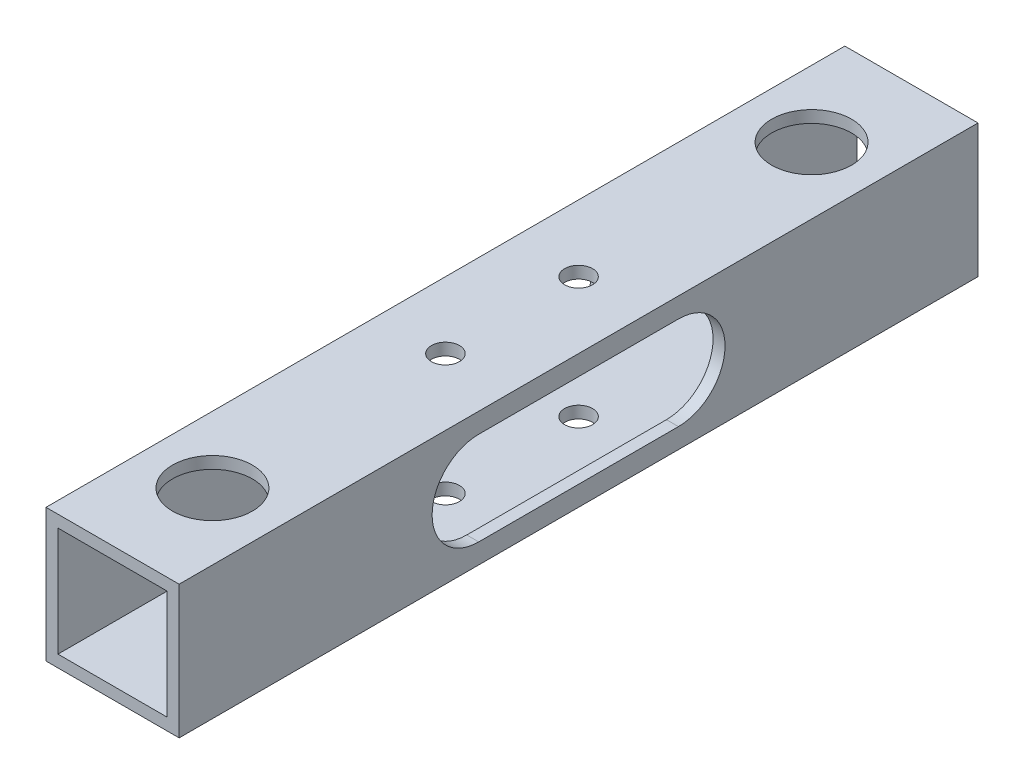
ISO-10303-21;
HEADER;
FILE_DESCRIPTION(('STEP AP214'),'2;1');
FILE_NAME('part.step','',(''),(''),'','','');
FILE_SCHEMA(('AUTOMOTIVE_DESIGN { 1 0 10303 214 1 1 1 1 }'));
ENDSEC;
DATA;
#1=APPLICATION_CONTEXT('core data for automotive mechanical design processes');
#2=APPLICATION_PROTOCOL_DEFINITION('international standard','automotive_design',2000,#1);
#3=PRODUCT_CONTEXT('',#1,'mechanical');
#4=PRODUCT('Part','Part','',(#3));
#5=PRODUCT_RELATED_PRODUCT_CATEGORY('part','',(#4));
#6=PRODUCT_DEFINITION_FORMATION('','',#4);
#7=PRODUCT_DEFINITION_CONTEXT('part definition',#1,'design');
#8=PRODUCT_DEFINITION('design','',#6,#7);
#9=PRODUCT_DEFINITION_SHAPE('','',#8);
#10=(LENGTH_UNIT() NAMED_UNIT(*) SI_UNIT(.MILLI.,.METRE.));
#11=(NAMED_UNIT(*) PLANE_ANGLE_UNIT() SI_UNIT($,.RADIAN.));
#12=(NAMED_UNIT(*) SI_UNIT($,.STERADIAN.) SOLID_ANGLE_UNIT());
#13=UNCERTAINTY_MEASURE_WITH_UNIT(LENGTH_MEASURE(1.E-05),#10,'distance_accuracy_value','');
#14=(GEOMETRIC_REPRESENTATION_CONTEXT(3) GLOBAL_UNCERTAINTY_ASSIGNED_CONTEXT((#13)) GLOBAL_UNIT_ASSIGNED_CONTEXT((#10,
#11,#12)) REPRESENTATION_CONTEXT('',''));
#15=CARTESIAN_POINT('',(0.,0.,0.));
#16=DIRECTION('',(0.,0.,1.));
#17=DIRECTION('',(1.,0.,0.));
#18=AXIS2_PLACEMENT_3D('',#15,#16,#17);
#19=CARTESIAN_POINT('',(0.,20.,-120.));
#20=DIRECTION('',(0.,1.,0.));
#21=DIRECTION('',(0.,0.,1.));
#22=AXIS2_PLACEMENT_3D('',#19,#20,#21);
#23=PLANE('',#22);
#24=CARTESIAN_POINT('',(10.,20.,-15.));
#25=DIRECTION('',(0.,-1.,0.));
#26=DIRECTION('',(0.,0.,-1.));
#27=AXIS2_PLACEMENT_3D('',#24,#25,#26);
#28=CIRCLE('',#27,6.);
#29=CARTESIAN_POINT('',(10.,20.,-21.));
#30=VERTEX_POINT('',#29);
#31=EDGE_CURVE('E395',#30,#30,#28,.T.);
#32=ORIENTED_EDGE('',*,*,#31,.T.);
#33=EDGE_LOOP('',(#32));
#34=FACE_BOUND('',#33,.T.);
#35=CARTESIAN_POINT('',(10.,20.,-70.));
#36=DIRECTION('',(0.,-1.,0.));
#37=DIRECTION('',(0.,0.,-1.));
#38=AXIS2_PLACEMENT_3D('',#35,#36,#37);
#39=CIRCLE('',#38,2.1);
#40=CARTESIAN_POINT('',(10.,20.,-72.1));
#41=VERTEX_POINT('',#40);
#42=EDGE_CURVE('E219',#41,#41,#39,.T.);
#43=ORIENTED_EDGE('',*,*,#42,.T.);
#44=EDGE_LOOP('',(#43));
#45=FACE_BOUND('',#44,.T.);
#46=CARTESIAN_POINT('',(10.,20.,-50.));
#47=DIRECTION('',(0.,-1.,0.));
#48=DIRECTION('',(0.,0.,-1.));
#49=AXIS2_PLACEMENT_3D('',#46,#47,#48);
#50=CIRCLE('',#49,2.1);
#51=CARTESIAN_POINT('',(10.,20.,-52.1));
#52=VERTEX_POINT('',#51);
#53=EDGE_CURVE('E229',#52,#52,#50,.T.);
#54=ORIENTED_EDGE('',*,*,#53,.T.);
#55=EDGE_LOOP('',(#54));
#56=FACE_BOUND('',#55,.T.);
#57=DIRECTION('',(-1.,0.,0.));
#58=VECTOR('',#57,1.);
#59=CARTESIAN_POINT('',(0.,20.,0.));
#60=LINE('',#59,#58);
#61=CARTESIAN_POINT('',(20.,20.,0.));
#62=VERTEX_POINT('',#61);
#63=CARTESIAN_POINT('',(0.,20.,0.));
#64=VERTEX_POINT('',#63);
#65=EDGE_CURVE('E279',#62,#64,#60,.T.);
#66=ORIENTED_EDGE('',*,*,#65,.F.);
#67=DIRECTION('',(0.,0.,1.));
#68=VECTOR('',#67,1.);
#69=CARTESIAN_POINT('',(20.,20.,-120.));
#70=LINE('',#69,#68);
#71=CARTESIAN_POINT('',(20.,20.,-120.));
#72=VERTEX_POINT('',#71);
#73=EDGE_CURVE('E302',#72,#62,#70,.T.);
#74=ORIENTED_EDGE('',*,*,#73,.F.);
#75=DIRECTION('',(-1.,0.,0.));
#76=VECTOR('',#75,1.);
#77=CARTESIAN_POINT('',(0.,20.,-120.));
#78=LINE('',#77,#76);
#79=CARTESIAN_POINT('',(0.,20.,-120.));
#80=VERTEX_POINT('',#79);
#81=EDGE_CURVE('E285',#72,#80,#78,.T.);
#82=ORIENTED_EDGE('',*,*,#81,.T.);
#83=DIRECTION('',(0.,0.,1.));
#84=VECTOR('',#83,1.);
#85=CARTESIAN_POINT('',(0.,20.,-120.));
#86=LINE('',#85,#84);
#87=EDGE_CURVE('E299',#80,#64,#86,.T.);
#88=ORIENTED_EDGE('',*,*,#87,.T.);
#89=EDGE_LOOP('',(#66,#74,#82,#88));
#90=FACE_BOUND('',#89,.T.);
#91=CARTESIAN_POINT('',(10.,20.,-105.));
#92=DIRECTION('',(0.,-1.,0.));
#93=DIRECTION('',(0.,0.,-1.));
#94=AXIS2_PLACEMENT_3D('',#91,#92,#93);
#95=CIRCLE('',#94,6.);
#96=CARTESIAN_POINT('',(10.,20.,-111.));
#97=VERTEX_POINT('',#96);
#98=EDGE_CURVE('E188',#97,#97,#95,.T.);
#99=ORIENTED_EDGE('',*,*,#98,.T.);
#100=EDGE_LOOP('',(#99));
#101=FACE_BOUND('',#100,.T.);
#102=ADVANCED_FACE('F37',(#34,#45,#56,#90,#101),#23,.T.);
#103=CARTESIAN_POINT('',(1.8,18.2,-120.));
#104=DIRECTION('',(0.,1.,0.));
#105=DIRECTION('',(0.,0.,1.));
#106=AXIS2_PLACEMENT_3D('',#103,#104,#105);
#107=PLANE('',#106);
#108=CARTESIAN_POINT('',(10.,18.2,-15.));
#109=DIRECTION('',(0.,1.,0.));
#110=DIRECTION('',(0.,0.,1.));
#111=AXIS2_PLACEMENT_3D('',#108,#109,#110);
#112=CIRCLE('',#111,6.);
#113=CARTESIAN_POINT('',(10.,18.2,-9.));
#114=VERTEX_POINT('',#113);
#115=EDGE_CURVE('E181',#114,#114,#112,.T.);
#116=ORIENTED_EDGE('',*,*,#115,.T.);
#117=EDGE_LOOP('',(#116));
#118=FACE_BOUND('',#117,.T.);
#119=CARTESIAN_POINT('',(10.,18.2,-70.));
#120=DIRECTION('',(0.,1.,0.));
#121=DIRECTION('',(0.,0.,1.));
#122=AXIS2_PLACEMENT_3D('',#119,#120,#121);
#123=CIRCLE('',#122,2.1);
#124=CARTESIAN_POINT('',(10.,18.2,-67.9));
#125=VERTEX_POINT('',#124);
#126=EDGE_CURVE('E223',#125,#125,#123,.T.);
#127=ORIENTED_EDGE('',*,*,#126,.T.);
#128=EDGE_LOOP('',(#127));
#129=FACE_BOUND('',#128,.T.);
#130=CARTESIAN_POINT('',(10.,18.2,-50.));
#131=DIRECTION('',(0.,1.,0.));
#132=DIRECTION('',(0.,0.,1.));
#133=AXIS2_PLACEMENT_3D('',#130,#131,#132);
#134=CIRCLE('',#133,2.1);
#135=CARTESIAN_POINT('',(10.,18.2,-47.9));
#136=VERTEX_POINT('',#135);
#137=EDGE_CURVE('E235',#136,#136,#134,.T.);
#138=ORIENTED_EDGE('',*,*,#137,.T.);
#139=EDGE_LOOP('',(#138));
#140=FACE_BOUND('',#139,.T.);
#141=DIRECTION('',(-1.,0.,0.));
#142=VECTOR('',#141,1.);
#143=CARTESIAN_POINT('',(1.8,18.2,0.));
#144=LINE('',#143,#142);
#145=CARTESIAN_POINT('',(18.2,18.2,0.));
#146=VERTEX_POINT('',#145);
#147=CARTESIAN_POINT('',(1.8,18.2,0.));
#148=VERTEX_POINT('',#147);
#149=EDGE_CURVE('E246',#146,#148,#144,.T.);
#150=ORIENTED_EDGE('',*,*,#149,.T.);
#151=DIRECTION('',(0.,0.,1.));
#152=VECTOR('',#151,1.);
#153=CARTESIAN_POINT('',(1.8,18.2,-120.));
#154=LINE('',#153,#152);
#155=CARTESIAN_POINT('',(1.8,18.2,-120.));
#156=VERTEX_POINT('',#155);
#157=EDGE_CURVE('E266',#156,#148,#154,.T.);
#158=ORIENTED_EDGE('',*,*,#157,.F.);
#159=DIRECTION('',(-1.,0.,0.));
#160=VECTOR('',#159,1.);
#161=CARTESIAN_POINT('',(1.8,18.2,-120.));
#162=LINE('',#161,#160);
#163=CARTESIAN_POINT('',(18.2,18.2,-120.));
#164=VERTEX_POINT('',#163);
#165=EDGE_CURVE('E252',#164,#156,#162,.T.);
#166=ORIENTED_EDGE('',*,*,#165,.F.);
#167=DIRECTION('',(0.,0.,1.));
#168=VECTOR('',#167,1.);
#169=CARTESIAN_POINT('',(18.2,18.2,-120.));
#170=LINE('',#169,#168);
#171=EDGE_CURVE('E269',#164,#146,#170,.T.);
#172=ORIENTED_EDGE('',*,*,#171,.T.);
#173=EDGE_LOOP('',(#150,#158,#166,#172));
#174=FACE_BOUND('',#173,.T.);
#175=CARTESIAN_POINT('',(10.,18.2,-105.));
#176=DIRECTION('',(0.,1.,0.));
#177=DIRECTION('',(0.,0.,1.));
#178=AXIS2_PLACEMENT_3D('',#175,#176,#177);
#179=CIRCLE('',#178,6.);
#180=CARTESIAN_POINT('',(10.,18.2,-99.));
#181=VERTEX_POINT('',#180);
#182=EDGE_CURVE('E392',#181,#181,#179,.T.);
#183=ORIENTED_EDGE('',*,*,#182,.T.);
#184=EDGE_LOOP('',(#183));
#185=FACE_BOUND('',#184,.T.);
#186=ADVANCED_FACE('F346',(#118,#129,#140,#174,#185),#107,.F.);
#187=CARTESIAN_POINT('',(0.,0.,-120.));
#188=DIRECTION('',(-1.,0.,0.));
#189=DIRECTION('',(0.,0.,1.));
#190=AXIS2_PLACEMENT_3D('',#187,#188,#189);
#191=PLANE('',#190);
#192=CARTESIAN_POINT('',(0.,10.,-45.));
#193=DIRECTION('',(1.,0.,0.));
#194=DIRECTION('',(0.,1.,0.));
#195=AXIS2_PLACEMENT_3D('',#192,#193,#194);
#196=CIRCLE('',#195,7.);
#197=CARTESIAN_POINT('',(0.,17.,-45.));
#198=VERTEX_POINT('',#197);
#199=CARTESIAN_POINT('',(0.,3.,-45.));
#200=VERTEX_POINT('',#199);
#201=EDGE_CURVE('E157',#198,#200,#196,.T.);
#202=ORIENTED_EDGE('',*,*,#201,.T.);
#203=DIRECTION('',(0.,0.,-1.));
#204=VECTOR('',#203,1.);
#205=CARTESIAN_POINT('',(0.,3.,-45.));
#206=LINE('',#205,#204);
#207=CARTESIAN_POINT('',(0.,3.,-75.));
#208=VERTEX_POINT('',#207);
#209=EDGE_CURVE('E167',#200,#208,#206,.T.);
#210=ORIENTED_EDGE('',*,*,#209,.T.);
#211=CARTESIAN_POINT('',(0.,10.,-75.));
#212=DIRECTION('',(1.,0.,0.));
#213=DIRECTION('',(0.,1.,0.));
#214=AXIS2_PLACEMENT_3D('',#211,#212,#213);
#215=CIRCLE('',#214,7.);
#216=CARTESIAN_POINT('',(0.,17.,-75.));
#217=VERTEX_POINT('',#216);
#218=EDGE_CURVE('E52',#208,#217,#215,.T.);
#219=ORIENTED_EDGE('',*,*,#218,.T.);
#220=DIRECTION('',(0.,0.,1.));
#221=VECTOR('',#220,1.);
#222=CARTESIAN_POINT('',(0.,17.,-45.));
#223=LINE('',#222,#221);
#224=EDGE_CURVE('E174',#217,#198,#223,.T.);
#225=ORIENTED_EDGE('',*,*,#224,.T.);
#226=EDGE_LOOP('',(#202,#210,#219,#225));
#227=FACE_BOUND('',#226,.T.);
#228=DIRECTION('',(0.,-1.,0.));
#229=VECTOR('',#228,1.);
#230=CARTESIAN_POINT('',(0.,0.,0.));
#231=LINE('',#230,#229);
#232=CARTESIAN_POINT('',(0.,0.,0.));
#233=VERTEX_POINT('',#232);
#234=EDGE_CURVE('E268',#64,#233,#231,.T.);
#235=ORIENTED_EDGE('',*,*,#234,.F.);
#236=ORIENTED_EDGE('',*,*,#87,.F.);
#237=DIRECTION('',(0.,-1.,0.));
#238=VECTOR('',#237,1.);
#239=CARTESIAN_POINT('',(0.,0.,-120.));
#240=LINE('',#239,#238);
#241=CARTESIAN_POINT('',(0.,0.,-120.));
#242=VERTEX_POINT('',#241);
#243=EDGE_CURVE('E275',#80,#242,#240,.T.);
#244=ORIENTED_EDGE('',*,*,#243,.T.);
#245=DIRECTION('',(0.,0.,1.));
#246=VECTOR('',#245,1.);
#247=CARTESIAN_POINT('',(0.,0.,-120.));
#248=LINE('',#247,#246);
#249=EDGE_CURVE('E288',#242,#233,#248,.T.);
#250=ORIENTED_EDGE('',*,*,#249,.T.);
#251=EDGE_LOOP('',(#235,#236,#244,#250));
#252=FACE_BOUND('',#251,.T.);
#253=ADVANCED_FACE('F39',(#227,#252),#191,.T.);
#254=CARTESIAN_POINT('',(20.,20.,-120.));
#255=DIRECTION('',(1.,0.,0.));
#256=DIRECTION('',(0.,1.,0.));
#257=AXIS2_PLACEMENT_3D('',#254,#255,#256);
#258=PLANE('',#257);
#259=CARTESIAN_POINT('',(20.,10.,-45.));
#260=DIRECTION('',(1.,0.,0.));
#261=DIRECTION('',(0.,1.,0.));
#262=AXIS2_PLACEMENT_3D('',#259,#260,#261);
#263=CIRCLE('',#262,7.);
#264=CARTESIAN_POINT('',(20.,17.,-45.));
#265=VERTEX_POINT('',#264);
#266=CARTESIAN_POINT('',(20.,3.,-45.));
#267=VERTEX_POINT('',#266);
#268=EDGE_CURVE('E60',#265,#267,#263,.T.);
#269=ORIENTED_EDGE('',*,*,#268,.F.);
#270=DIRECTION('',(0.,0.,1.));
#271=VECTOR('',#270,1.);
#272=CARTESIAN_POINT('',(20.,17.,-45.));
#273=LINE('',#272,#271);
#274=CARTESIAN_POINT('',(20.,17.,-75.));
#275=VERTEX_POINT('',#274);
#276=EDGE_CURVE('E175',#275,#265,#273,.T.);
#277=ORIENTED_EDGE('',*,*,#276,.F.);
#278=CARTESIAN_POINT('',(20.,10.,-75.));
#279=DIRECTION('',(1.,0.,0.));
#280=DIRECTION('',(0.,1.,0.));
#281=AXIS2_PLACEMENT_3D('',#278,#279,#280);
#282=CIRCLE('',#281,7.);
#283=CARTESIAN_POINT('',(20.,3.,-75.));
#284=VERTEX_POINT('',#283);
#285=EDGE_CURVE('E178',#284,#275,#282,.T.);
#286=ORIENTED_EDGE('',*,*,#285,.F.);
#287=DIRECTION('',(0.,0.,-1.));
#288=VECTOR('',#287,1.);
#289=CARTESIAN_POINT('',(20.,3.,-45.));
#290=LINE('',#289,#288);
#291=EDGE_CURVE('E187',#267,#284,#290,.T.);
#292=ORIENTED_EDGE('',*,*,#291,.F.);
#293=EDGE_LOOP('',(#269,#277,#286,#292));
#294=FACE_BOUND('',#293,.T.);
#295=DIRECTION('',(0.,1.,0.));
#296=VECTOR('',#295,1.);
#297=CARTESIAN_POINT('',(20.,20.,0.));
#298=LINE('',#297,#296);
#299=CARTESIAN_POINT('',(20.,0.,0.));
#300=VERTEX_POINT('',#299);
#301=EDGE_CURVE('E294',#300,#62,#298,.T.);
#302=ORIENTED_EDGE('',*,*,#301,.F.);
#303=DIRECTION('',(0.,0.,1.));
#304=VECTOR('',#303,1.);
#305=CARTESIAN_POINT('',(20.,0.,-120.));
#306=LINE('',#305,#304);
#307=CARTESIAN_POINT('',(20.,0.,-120.));
#308=VERTEX_POINT('',#307);
#309=EDGE_CURVE('E304',#308,#300,#306,.T.);
#310=ORIENTED_EDGE('',*,*,#309,.F.);
#311=DIRECTION('',(0.,1.,0.));
#312=VECTOR('',#311,1.);
#313=CARTESIAN_POINT('',(20.,20.,-120.));
#314=LINE('',#313,#312);
#315=EDGE_CURVE('E282',#308,#72,#314,.T.);
#316=ORIENTED_EDGE('',*,*,#315,.T.);
#317=ORIENTED_EDGE('',*,*,#73,.T.);
#318=EDGE_LOOP('',(#302,#310,#316,#317));
#319=FACE_BOUND('',#318,.T.);
#320=ADVANCED_FACE('F330',(#294,#319),#258,.T.);
#321=CARTESIAN_POINT('',(0.,0.,-120.));
#322=DIRECTION('',(0.,-1.,0.));
#323=DIRECTION('',(0.,0.,-1.));
#324=AXIS2_PLACEMENT_3D('',#321,#322,#323);
#325=PLANE('',#324);
#326=CARTESIAN_POINT('',(10.,0.,-105.));
#327=DIRECTION('',(0.,-1.,0.));
#328=DIRECTION('',(0.,0.,-1.));
#329=AXIS2_PLACEMENT_3D('',#326,#327,#328);
#330=CIRCLE('',#329,2.1);
#331=CARTESIAN_POINT('',(10.,0.,-107.1));
#332=VERTEX_POINT('',#331);
#333=EDGE_CURVE('E210',#332,#332,#330,.T.);
#334=ORIENTED_EDGE('',*,*,#333,.F.);
#335=EDGE_LOOP('',(#334));
#336=FACE_BOUND('',#335,.T.);
#337=CARTESIAN_POINT('',(10.,0.,-70.));
#338=DIRECTION('',(0.,-1.,0.));
#339=DIRECTION('',(0.,0.,-1.));
#340=AXIS2_PLACEMENT_3D('',#337,#338,#339);
#341=CIRCLE('',#340,2.1);
#342=CARTESIAN_POINT('',(10.,0.,-72.1));
#343=VERTEX_POINT('',#342);
#344=EDGE_CURVE('E216',#343,#343,#341,.T.);
#345=ORIENTED_EDGE('',*,*,#344,.F.);
#346=EDGE_LOOP('',(#345));
#347=FACE_BOUND('',#346,.T.);
#348=CARTESIAN_POINT('',(10.,0.,-50.));
#349=DIRECTION('',(0.,-1.,0.));
#350=DIRECTION('',(0.,0.,-1.));
#351=AXIS2_PLACEMENT_3D('',#348,#349,#350);
#352=CIRCLE('',#351,2.1);
#353=CARTESIAN_POINT('',(10.,0.,-52.1));
#354=VERTEX_POINT('',#353);
#355=EDGE_CURVE('E226',#354,#354,#352,.T.);
#356=ORIENTED_EDGE('',*,*,#355,.F.);
#357=EDGE_LOOP('',(#356));
#358=FACE_BOUND('',#357,.T.);
#359=CARTESIAN_POINT('',(10.,0.,-15.));
#360=DIRECTION('',(0.,-1.,0.));
#361=DIRECTION('',(0.,0.,-1.));
#362=AXIS2_PLACEMENT_3D('',#359,#360,#361);
#363=CIRCLE('',#362,2.1);
#364=CARTESIAN_POINT('',(10.,0.,-17.1));
#365=VERTEX_POINT('',#364);
#366=EDGE_CURVE('E238',#365,#365,#363,.T.);
#367=ORIENTED_EDGE('',*,*,#366,.F.);
#368=EDGE_LOOP('',(#367));
#369=FACE_BOUND('',#368,.T.);
#370=DIRECTION('',(1.,0.,0.));
#371=VECTOR('',#370,1.);
#372=CARTESIAN_POINT('',(0.,0.,0.));
#373=LINE('',#372,#371);
#374=EDGE_CURVE('E291',#233,#300,#373,.T.);
#375=ORIENTED_EDGE('',*,*,#374,.F.);
#376=ORIENTED_EDGE('',*,*,#249,.F.);
#377=DIRECTION('',(1.,0.,0.));
#378=VECTOR('',#377,1.);
#379=CARTESIAN_POINT('',(0.,0.,-120.));
#380=LINE('',#379,#378);
#381=EDGE_CURVE('E278',#242,#308,#380,.T.);
#382=ORIENTED_EDGE('',*,*,#381,.T.);
#383=ORIENTED_EDGE('',*,*,#309,.T.);
#384=EDGE_LOOP('',(#375,#376,#382,#383));
#385=FACE_BOUND('',#384,.T.);
#386=ADVANCED_FACE('F361',(#336,#347,#358,#369,#385),#325,.T.);
#387=CARTESIAN_POINT('',(0.,20.,-120.));
#388=DIRECTION('',(0.,0.,-1.));
#389=DIRECTION('',(-1.,0.,0.));
#390=AXIS2_PLACEMENT_3D('',#387,#388,#389);
#391=PLANE('',#390);
#392=DIRECTION('',(0.,-1.,0.));
#393=VECTOR('',#392,1.);
#394=CARTESIAN_POINT('',(1.8,1.8,-120.));
#395=LINE('',#394,#393);
#396=CARTESIAN_POINT('',(1.8,1.8,-120.));
#397=VERTEX_POINT('',#396);
#398=EDGE_CURVE('E242',#156,#397,#395,.T.);
#399=ORIENTED_EDGE('',*,*,#398,.T.);
#400=DIRECTION('',(1.,0.,0.));
#401=VECTOR('',#400,1.);
#402=CARTESIAN_POINT('',(1.8,1.8,-120.));
#403=LINE('',#402,#401);
#404=CARTESIAN_POINT('',(18.2,1.8,-120.));
#405=VERTEX_POINT('',#404);
#406=EDGE_CURVE('E245',#397,#405,#403,.T.);
#407=ORIENTED_EDGE('',*,*,#406,.T.);
#408=DIRECTION('',(0.,1.,0.));
#409=VECTOR('',#408,1.);
#410=CARTESIAN_POINT('',(18.2,18.2,-120.));
#411=LINE('',#410,#409);
#412=EDGE_CURVE('E249',#405,#164,#411,.T.);
#413=ORIENTED_EDGE('',*,*,#412,.T.);
#414=ORIENTED_EDGE('',*,*,#165,.T.);
#415=EDGE_LOOP('',(#399,#407,#413,#414));
#416=FACE_BOUND('',#415,.T.);
#417=ORIENTED_EDGE('',*,*,#243,.F.);
#418=ORIENTED_EDGE('',*,*,#81,.F.);
#419=ORIENTED_EDGE('',*,*,#315,.F.);
#420=ORIENTED_EDGE('',*,*,#381,.F.);
#421=EDGE_LOOP('',(#417,#418,#419,#420));
#422=FACE_BOUND('',#421,.T.);
#423=ADVANCED_FACE('F363',(#416,#422),#391,.T.);
#424=CARTESIAN_POINT('',(0.,20.,0.));
#425=DIRECTION('',(0.,0.,-1.));
#426=DIRECTION('',(-1.,0.,0.));
#427=AXIS2_PLACEMENT_3D('',#424,#425,#426);
#428=PLANE('',#427);
#429=DIRECTION('',(1.,0.,0.));
#430=VECTOR('',#429,1.);
#431=CARTESIAN_POINT('',(1.8,1.8,0.));
#432=LINE('',#431,#430);
#433=CARTESIAN_POINT('',(1.8,1.8,0.));
#434=VERTEX_POINT('',#433);
#435=CARTESIAN_POINT('',(18.2,1.8,0.));
#436=VERTEX_POINT('',#435);
#437=EDGE_CURVE('E258',#434,#436,#432,.T.);
#438=ORIENTED_EDGE('',*,*,#437,.F.);
#439=DIRECTION('',(0.,-1.,0.));
#440=VECTOR('',#439,1.);
#441=CARTESIAN_POINT('',(1.8,1.8,0.));
#442=LINE('',#441,#440);
#443=EDGE_CURVE('E256',#148,#434,#442,.T.);
#444=ORIENTED_EDGE('',*,*,#443,.F.);
#445=ORIENTED_EDGE('',*,*,#149,.F.);
#446=DIRECTION('',(0.,1.,0.));
#447=VECTOR('',#446,1.);
#448=CARTESIAN_POINT('',(18.2,18.2,0.));
#449=LINE('',#448,#447);
#450=EDGE_CURVE('E261',#436,#146,#449,.T.);
#451=ORIENTED_EDGE('',*,*,#450,.F.);
#452=EDGE_LOOP('',(#438,#444,#445,#451));
#453=FACE_BOUND('',#452,.T.);
#454=ORIENTED_EDGE('',*,*,#234,.T.);
#455=ORIENTED_EDGE('',*,*,#374,.T.);
#456=ORIENTED_EDGE('',*,*,#301,.T.);
#457=ORIENTED_EDGE('',*,*,#65,.T.);
#458=EDGE_LOOP('',(#454,#455,#456,#457));
#459=FACE_BOUND('',#458,.T.);
#460=ADVANCED_FACE('F358',(#453,#459),#428,.F.);
#461=CARTESIAN_POINT('',(1.8,1.8,-120.));
#462=DIRECTION('',(-1.,0.,0.));
#463=DIRECTION('',(0.,0.,1.));
#464=AXIS2_PLACEMENT_3D('',#461,#462,#463);
#465=PLANE('',#464);
#466=DIRECTION('',(0.,0.,1.));
#467=VECTOR('',#466,1.);
#468=CARTESIAN_POINT('',(1.8,3.,-120.));
#469=LINE('',#468,#467);
#470=CARTESIAN_POINT('',(1.8,3.,-75.));
#471=VERTEX_POINT('',#470);
#472=CARTESIAN_POINT('',(1.8,3.,-45.));
#473=VERTEX_POINT('',#472);
#474=EDGE_CURVE('E195',#471,#473,#469,.T.);
#475=ORIENTED_EDGE('',*,*,#474,.T.);
#476=CARTESIAN_POINT('',(1.8,10.,-45.));
#477=DIRECTION('',(-1.,0.,0.));
#478=DIRECTION('',(0.,0.,1.));
#479=AXIS2_PLACEMENT_3D('',#476,#477,#478);
#480=CIRCLE('',#479,7.);
#481=CARTESIAN_POINT('',(1.8,17.,-45.));
#482=VERTEX_POINT('',#481);
#483=EDGE_CURVE('E160',#473,#482,#480,.T.);
#484=ORIENTED_EDGE('',*,*,#483,.T.);
#485=DIRECTION('',(0.,0.,-1.));
#486=VECTOR('',#485,1.);
#487=CARTESIAN_POINT('',(1.8,17.,-120.));
#488=LINE('',#487,#486);
#489=CARTESIAN_POINT('',(1.8,17.,-75.));
#490=VERTEX_POINT('',#489);
#491=EDGE_CURVE('E206',#482,#490,#488,.T.);
#492=ORIENTED_EDGE('',*,*,#491,.T.);
#493=CARTESIAN_POINT('',(1.8,10.,-75.));
#494=DIRECTION('',(-1.,0.,0.));
#495=DIRECTION('',(0.,0.,1.));
#496=AXIS2_PLACEMENT_3D('',#493,#494,#495);
#497=CIRCLE('',#496,7.);
#498=EDGE_CURVE('E203',#490,#471,#497,.T.);
#499=ORIENTED_EDGE('',*,*,#498,.T.);
#500=EDGE_LOOP('',(#475,#484,#492,#499));
#501=FACE_BOUND('',#500,.T.);
#502=ORIENTED_EDGE('',*,*,#443,.T.);
#503=DIRECTION('',(0.,0.,1.));
#504=VECTOR('',#503,1.);
#505=CARTESIAN_POINT('',(1.8,1.8,-120.));
#506=LINE('',#505,#504);
#507=EDGE_CURVE('E255',#397,#434,#506,.T.);
#508=ORIENTED_EDGE('',*,*,#507,.F.);
#509=ORIENTED_EDGE('',*,*,#398,.F.);
#510=ORIENTED_EDGE('',*,*,#157,.T.);
#511=EDGE_LOOP('',(#502,#508,#509,#510));
#512=FACE_BOUND('',#511,.T.);
#513=ADVANCED_FACE('F449',(#501,#512),#465,.F.);
#514=CARTESIAN_POINT('',(18.2,18.2,-120.));
#515=DIRECTION('',(1.,0.,0.));
#516=DIRECTION('',(0.,1.,0.));
#517=AXIS2_PLACEMENT_3D('',#514,#515,#516);
#518=PLANE('',#517);
#519=DIRECTION('',(0.,0.,1.));
#520=VECTOR('',#519,1.);
#521=CARTESIAN_POINT('',(18.2,17.,-120.));
#522=LINE('',#521,#520);
#523=CARTESIAN_POINT('',(18.2,17.,-75.));
#524=VERTEX_POINT('',#523);
#525=CARTESIAN_POINT('',(18.2,17.,-45.));
#526=VERTEX_POINT('',#525);
#527=EDGE_CURVE('E45',#524,#526,#522,.T.);
#528=ORIENTED_EDGE('',*,*,#527,.T.);
#529=CARTESIAN_POINT('',(18.2,10.,-45.));
#530=DIRECTION('',(1.,0.,0.));
#531=DIRECTION('',(0.,1.,0.));
#532=AXIS2_PLACEMENT_3D('',#529,#530,#531);
#533=CIRCLE('',#532,7.);
#534=CARTESIAN_POINT('',(18.2,3.,-45.));
#535=VERTEX_POINT('',#534);
#536=EDGE_CURVE('E11',#526,#535,#533,.T.);
#537=ORIENTED_EDGE('',*,*,#536,.T.);
#538=DIRECTION('',(0.,0.,-1.));
#539=VECTOR('',#538,1.);
#540=CARTESIAN_POINT('',(18.2,3.,-120.));
#541=LINE('',#540,#539);
#542=CARTESIAN_POINT('',(18.2,3.,-75.));
#543=VERTEX_POINT('',#542);
#544=EDGE_CURVE('E301',#535,#543,#541,.T.);
#545=ORIENTED_EDGE('',*,*,#544,.T.);
#546=CARTESIAN_POINT('',(18.2,10.,-75.));
#547=DIRECTION('',(1.,0.,0.));
#548=DIRECTION('',(0.,1.,0.));
#549=AXIS2_PLACEMENT_3D('',#546,#547,#548);
#550=CIRCLE('',#549,7.);
#551=EDGE_CURVE('E313',#543,#524,#550,.T.);
#552=ORIENTED_EDGE('',*,*,#551,.T.);
#553=EDGE_LOOP('',(#528,#537,#545,#552));
#554=FACE_BOUND('',#553,.T.);
#555=ORIENTED_EDGE('',*,*,#450,.T.);
#556=ORIENTED_EDGE('',*,*,#171,.F.);
#557=ORIENTED_EDGE('',*,*,#412,.F.);
#558=DIRECTION('',(0.,0.,1.));
#559=VECTOR('',#558,1.);
#560=CARTESIAN_POINT('',(18.2,1.8,-120.));
#561=LINE('',#560,#559);
#562=EDGE_CURVE('E271',#405,#436,#561,.T.);
#563=ORIENTED_EDGE('',*,*,#562,.T.);
#564=EDGE_LOOP('',(#555,#556,#557,#563));
#565=FACE_BOUND('',#564,.T.);
#566=ADVANCED_FACE('F317',(#554,#565),#518,.F.);
#567=CARTESIAN_POINT('',(1.8,1.8,-120.));
#568=DIRECTION('',(0.,-1.,0.));
#569=DIRECTION('',(1.,0.,0.));
#570=AXIS2_PLACEMENT_3D('',#567,#568,#569);
#571=PLANE('',#570);
#572=CARTESIAN_POINT('',(10.,1.8,-105.));
#573=DIRECTION('',(0.,-1.,0.));
#574=DIRECTION('',(1.,0.,0.));
#575=AXIS2_PLACEMENT_3D('',#572,#573,#574);
#576=CIRCLE('',#575,2.1);
#577=CARTESIAN_POINT('',(12.1,1.8,-105.));
#578=VERTEX_POINT('',#577);
#579=EDGE_CURVE('E213',#578,#578,#576,.T.);
#580=ORIENTED_EDGE('',*,*,#579,.T.);
#581=EDGE_LOOP('',(#580));
#582=FACE_BOUND('',#581,.T.);
#583=CARTESIAN_POINT('',(10.,1.8,-70.));
#584=DIRECTION('',(0.,-1.,0.));
#585=DIRECTION('',(1.,0.,0.));
#586=AXIS2_PLACEMENT_3D('',#583,#584,#585);
#587=CIRCLE('',#586,2.1);
#588=CARTESIAN_POINT('',(12.1,1.8,-70.));
#589=VERTEX_POINT('',#588);
#590=EDGE_CURVE('E222',#589,#589,#587,.T.);
#591=ORIENTED_EDGE('',*,*,#590,.T.);
#592=EDGE_LOOP('',(#591));
#593=FACE_BOUND('',#592,.T.);
#594=CARTESIAN_POINT('',(10.,1.8,-50.));
#595=DIRECTION('',(0.,-1.,0.));
#596=DIRECTION('',(1.,0.,0.));
#597=AXIS2_PLACEMENT_3D('',#594,#595,#596);
#598=CIRCLE('',#597,2.1);
#599=CARTESIAN_POINT('',(12.1,1.8,-50.));
#600=VERTEX_POINT('',#599);
#601=EDGE_CURVE('E232',#600,#600,#598,.T.);
#602=ORIENTED_EDGE('',*,*,#601,.T.);
#603=EDGE_LOOP('',(#602));
#604=FACE_BOUND('',#603,.T.);
#605=CARTESIAN_POINT('',(10.,1.8,-15.));
#606=DIRECTION('',(0.,-1.,0.));
#607=DIRECTION('',(1.,0.,0.));
#608=AXIS2_PLACEMENT_3D('',#605,#606,#607);
#609=CIRCLE('',#608,2.1);
#610=CARTESIAN_POINT('',(12.1,1.8,-15.));
#611=VERTEX_POINT('',#610);
#612=EDGE_CURVE('E241',#611,#611,#609,.T.);
#613=ORIENTED_EDGE('',*,*,#612,.T.);
#614=EDGE_LOOP('',(#613));
#615=FACE_BOUND('',#614,.T.);
#616=ORIENTED_EDGE('',*,*,#437,.T.);
#617=ORIENTED_EDGE('',*,*,#562,.F.);
#618=ORIENTED_EDGE('',*,*,#406,.F.);
#619=ORIENTED_EDGE('',*,*,#507,.T.);
#620=EDGE_LOOP('',(#616,#617,#618,#619));
#621=FACE_BOUND('',#620,.T.);
#622=ADVANCED_FACE('F444',(#582,#593,#604,#615,#621),#571,.F.);
#623=CARTESIAN_POINT('',(10.,0.,-15.));
#624=DIRECTION('',(0.,-1.,0.));
#625=DIRECTION('',(0.,0.,-1.));
#626=AXIS2_PLACEMENT_3D('',#623,#624,#625);
#627=CYLINDRICAL_SURFACE('',#626,2.1);
#628=ORIENTED_EDGE('',*,*,#366,.T.);
#629=EDGE_LOOP('',(#628));
#630=FACE_BOUND('',#629,.T.);
#631=ORIENTED_EDGE('',*,*,#612,.F.);
#632=EDGE_LOOP('',(#631));
#633=FACE_BOUND('',#632,.T.);
#634=ADVANCED_FACE('F442',(#630,#633),#627,.F.);
#635=CARTESIAN_POINT('',(10.,0.,-50.));
#636=DIRECTION('',(0.,-1.,0.));
#637=DIRECTION('',(0.,0.,-1.));
#638=AXIS2_PLACEMENT_3D('',#635,#636,#637);
#639=CYLINDRICAL_SURFACE('',#638,2.1);
#640=ORIENTED_EDGE('',*,*,#355,.T.);
#641=EDGE_LOOP('',(#640));
#642=FACE_BOUND('',#641,.T.);
#643=ORIENTED_EDGE('',*,*,#601,.F.);
#644=EDGE_LOOP('',(#643));
#645=FACE_BOUND('',#644,.T.);
#646=ADVANCED_FACE('F440',(#642,#645),#639,.F.);
#647=ORIENTED_EDGE('',*,*,#53,.F.);
#648=EDGE_LOOP('',(#647));
#649=FACE_BOUND('',#648,.T.);
#650=ORIENTED_EDGE('',*,*,#137,.F.);
#651=EDGE_LOOP('',(#650));
#652=FACE_BOUND('',#651,.T.);
#653=ADVANCED_FACE('F437',(#649,#652),#639,.F.);
#654=CARTESIAN_POINT('',(10.,0.,-70.));
#655=DIRECTION('',(0.,-1.,0.));
#656=DIRECTION('',(0.,0.,-1.));
#657=AXIS2_PLACEMENT_3D('',#654,#655,#656);
#658=CYLINDRICAL_SURFACE('',#657,2.1);
#659=ORIENTED_EDGE('',*,*,#344,.T.);
#660=EDGE_LOOP('',(#659));
#661=FACE_BOUND('',#660,.T.);
#662=ORIENTED_EDGE('',*,*,#590,.F.);
#663=EDGE_LOOP('',(#662));
#664=FACE_BOUND('',#663,.T.);
#665=ADVANCED_FACE('F432',(#661,#664),#658,.F.);
#666=ORIENTED_EDGE('',*,*,#42,.F.);
#667=EDGE_LOOP('',(#666));
#668=FACE_BOUND('',#667,.T.);
#669=ORIENTED_EDGE('',*,*,#126,.F.);
#670=EDGE_LOOP('',(#669));
#671=FACE_BOUND('',#670,.T.);
#672=ADVANCED_FACE('F427',(#668,#671),#658,.F.);
#673=CARTESIAN_POINT('',(10.,0.,-105.));
#674=DIRECTION('',(0.,-1.,0.));
#675=DIRECTION('',(0.,0.,-1.));
#676=AXIS2_PLACEMENT_3D('',#673,#674,#675);
#677=CYLINDRICAL_SURFACE('',#676,2.1);
#678=ORIENTED_EDGE('',*,*,#333,.T.);
#679=EDGE_LOOP('',(#678));
#680=FACE_BOUND('',#679,.T.);
#681=ORIENTED_EDGE('',*,*,#579,.F.);
#682=EDGE_LOOP('',(#681));
#683=FACE_BOUND('',#682,.T.);
#684=ADVANCED_FACE('F423',(#680,#683),#677,.F.);
#685=CARTESIAN_POINT('',(0.,3.,-45.));
#686=DIRECTION('',(0.,-1.,0.));
#687=DIRECTION('',(1.,0.,0.));
#688=AXIS2_PLACEMENT_3D('',#685,#686,#687);
#689=PLANE('',#688);
#690=DIRECTION('',(1.,0.,0.));
#691=VECTOR('',#690,1.);
#692=CARTESIAN_POINT('',(0.,3.,-45.));
#693=LINE('',#692,#691);
#694=EDGE_CURVE('E164',#535,#267,#693,.T.);
#695=ORIENTED_EDGE('',*,*,#694,.T.);
#696=ORIENTED_EDGE('',*,*,#291,.T.);
#697=DIRECTION('',(1.,0.,0.));
#698=VECTOR('',#697,1.);
#699=CARTESIAN_POINT('',(0.,3.,-75.));
#700=LINE('',#699,#698);
#701=EDGE_CURVE('E163',#543,#284,#700,.T.);
#702=ORIENTED_EDGE('',*,*,#701,.F.);
#703=ORIENTED_EDGE('',*,*,#544,.F.);
#704=EDGE_LOOP('',(#695,#696,#702,#703));
#705=FACE_BOUND('',#704,.T.);
#706=ADVANCED_FACE('F333',(#705),#689,.F.);
#707=CARTESIAN_POINT('',(0.,10.,-75.));
#708=DIRECTION('',(1.,0.,0.));
#709=DIRECTION('',(0.,1.,0.));
#710=AXIS2_PLACEMENT_3D('',#707,#708,#709);
#711=CYLINDRICAL_SURFACE('',#710,7.);
#712=ORIENTED_EDGE('',*,*,#701,.T.);
#713=ORIENTED_EDGE('',*,*,#285,.T.);
#714=DIRECTION('',(1.,0.,0.));
#715=VECTOR('',#714,1.);
#716=CARTESIAN_POINT('',(0.,17.,-75.));
#717=LINE('',#716,#715);
#718=EDGE_CURVE('E200',#524,#275,#717,.T.);
#719=ORIENTED_EDGE('',*,*,#718,.F.);
#720=ORIENTED_EDGE('',*,*,#551,.F.);
#721=EDGE_LOOP('',(#712,#713,#719,#720));
#722=FACE_BOUND('',#721,.T.);
#723=ADVANCED_FACE('F325',(#722),#711,.F.);
#724=CARTESIAN_POINT('',(0.,17.,-45.));
#725=DIRECTION('',(0.,1.,0.));
#726=DIRECTION('',(-1.,0.,0.));
#727=AXIS2_PLACEMENT_3D('',#724,#725,#726);
#728=PLANE('',#727);
#729=ORIENTED_EDGE('',*,*,#718,.T.);
#730=ORIENTED_EDGE('',*,*,#276,.T.);
#731=DIRECTION('',(1.,0.,0.));
#732=VECTOR('',#731,1.);
#733=CARTESIAN_POINT('',(0.,17.,-45.));
#734=LINE('',#733,#732);
#735=EDGE_CURVE('E196',#526,#265,#734,.T.);
#736=ORIENTED_EDGE('',*,*,#735,.F.);
#737=ORIENTED_EDGE('',*,*,#527,.F.);
#738=EDGE_LOOP('',(#729,#730,#736,#737));
#739=FACE_BOUND('',#738,.T.);
#740=ADVANCED_FACE('F323',(#739),#728,.F.);
#741=CARTESIAN_POINT('',(0.,10.,-45.));
#742=DIRECTION('',(1.,0.,0.));
#743=DIRECTION('',(0.,1.,0.));
#744=AXIS2_PLACEMENT_3D('',#741,#742,#743);
#745=CYLINDRICAL_SURFACE('',#744,7.);
#746=ORIENTED_EDGE('',*,*,#735,.T.);
#747=ORIENTED_EDGE('',*,*,#268,.T.);
#748=ORIENTED_EDGE('',*,*,#694,.F.);
#749=ORIENTED_EDGE('',*,*,#536,.F.);
#750=EDGE_LOOP('',(#746,#747,#748,#749));
#751=FACE_BOUND('',#750,.T.);
#752=ADVANCED_FACE('F334',(#751),#745,.F.);
#753=EDGE_CURVE('E152',#200,#473,#693,.T.);
#754=ORIENTED_EDGE('',*,*,#753,.F.);
#755=ORIENTED_EDGE('',*,*,#201,.F.);
#756=EDGE_CURVE('E193',#198,#482,#734,.T.);
#757=ORIENTED_EDGE('',*,*,#756,.T.);
#758=ORIENTED_EDGE('',*,*,#483,.F.);
#759=EDGE_LOOP('',(#754,#755,#757,#758));
#760=FACE_BOUND('',#759,.T.);
#761=ADVANCED_FACE('F154',(#760),#745,.F.);
#762=ORIENTED_EDGE('',*,*,#756,.F.);
#763=ORIENTED_EDGE('',*,*,#224,.F.);
#764=EDGE_CURVE('E197',#217,#490,#717,.T.);
#765=ORIENTED_EDGE('',*,*,#764,.T.);
#766=ORIENTED_EDGE('',*,*,#491,.F.);
#767=EDGE_LOOP('',(#762,#763,#765,#766));
#768=FACE_BOUND('',#767,.T.);
#769=ADVANCED_FACE('F341',(#768),#728,.F.);
#770=ORIENTED_EDGE('',*,*,#764,.F.);
#771=ORIENTED_EDGE('',*,*,#218,.F.);
#772=EDGE_CURVE('E169',#208,#471,#700,.T.);
#773=ORIENTED_EDGE('',*,*,#772,.T.);
#774=ORIENTED_EDGE('',*,*,#498,.F.);
#775=EDGE_LOOP('',(#770,#771,#773,#774));
#776=FACE_BOUND('',#775,.T.);
#777=ADVANCED_FACE('F412',(#776),#711,.F.);
#778=ORIENTED_EDGE('',*,*,#772,.F.);
#779=ORIENTED_EDGE('',*,*,#209,.F.);
#780=ORIENTED_EDGE('',*,*,#753,.T.);
#781=ORIENTED_EDGE('',*,*,#474,.F.);
#782=EDGE_LOOP('',(#778,#779,#780,#781));
#783=FACE_BOUND('',#782,.T.);
#784=ADVANCED_FACE('F168',(#783),#689,.F.);
#785=CARTESIAN_POINT('',(10.,-0.001000000000001,-15.));
#786=DIRECTION('',(0.,1.,0.));
#787=DIRECTION('',(0.,0.,1.));
#788=AXIS2_PLACEMENT_3D('',#785,#786,#787);
#789=CYLINDRICAL_SURFACE('',#788,6.);
#790=ORIENTED_EDGE('',*,*,#31,.F.);
#791=EDGE_LOOP('',(#790));
#792=FACE_BOUND('',#791,.T.);
#793=ORIENTED_EDGE('',*,*,#115,.F.);
#794=EDGE_LOOP('',(#793));
#795=FACE_BOUND('',#794,.T.);
#796=ADVANCED_FACE('F402',(#792,#795),#789,.F.);
#797=CARTESIAN_POINT('',(10.,-0.001000000000001,-105.));
#798=DIRECTION('',(0.,1.,0.));
#799=DIRECTION('',(0.,0.,1.));
#800=AXIS2_PLACEMENT_3D('',#797,#798,#799);
#801=CYLINDRICAL_SURFACE('',#800,6.);
#802=ORIENTED_EDGE('',*,*,#98,.F.);
#803=EDGE_LOOP('',(#802));
#804=FACE_BOUND('',#803,.T.);
#805=ORIENTED_EDGE('',*,*,#182,.F.);
#806=EDGE_LOOP('',(#805));
#807=FACE_BOUND('',#806,.T.);
#808=ADVANCED_FACE('F404',(#804,#807),#801,.F.);
#809=CLOSED_SHELL('',(#102,#186,#253,#320,#386,#423,#460,#513,#566,#622,#634,#646,#653,#665,
#672,#684,#706,#723,#740,#752,#761,#769,#777,#784,#796,#808));
#810=MANIFOLD_SOLID_BREP('B2',#809);
#811=ADVANCED_BREP_SHAPE_REPRESENTATION('',(#18,#810),#14);
#812=SHAPE_DEFINITION_REPRESENTATION(#9,#811);
ENDSEC;
END-ISO-10303-21;
